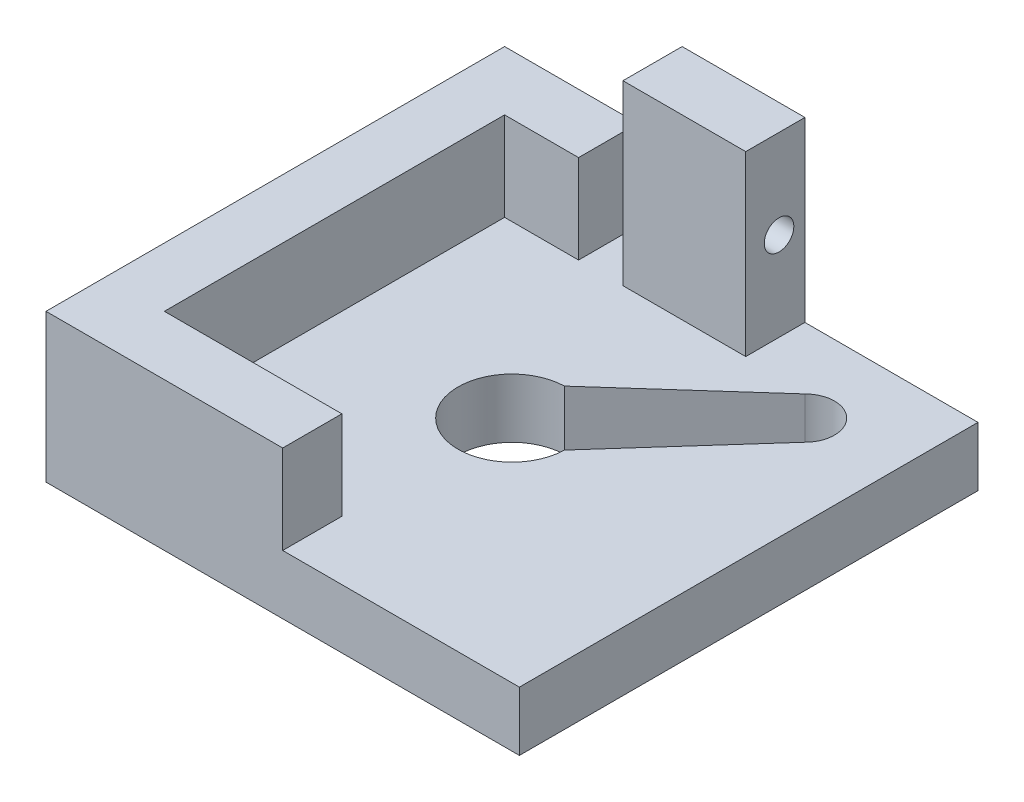
ISO-10303-21;
HEADER;
FILE_DESCRIPTION(('STEP AP214'),'2;1');
FILE_NAME('part.step','',(''),(''),'','','');
FILE_SCHEMA(('AUTOMOTIVE_DESIGN { 1 0 10303 214 1 1 1 1 }'));
ENDSEC;
DATA;
#1=APPLICATION_CONTEXT('core data for automotive mechanical design processes');
#2=APPLICATION_PROTOCOL_DEFINITION('international standard','automotive_design',2000,#1);
#3=PRODUCT_CONTEXT('',#1,'mechanical');
#4=PRODUCT('Part','Part','',(#3));
#5=PRODUCT_RELATED_PRODUCT_CATEGORY('part','',(#4));
#6=PRODUCT_DEFINITION_FORMATION('','',#4);
#7=PRODUCT_DEFINITION_CONTEXT('part definition',#1,'design');
#8=PRODUCT_DEFINITION('design','',#6,#7);
#9=PRODUCT_DEFINITION_SHAPE('','',#8);
#10=(LENGTH_UNIT() NAMED_UNIT(*) SI_UNIT(.MILLI.,.METRE.));
#11=(NAMED_UNIT(*) PLANE_ANGLE_UNIT() SI_UNIT($,.RADIAN.));
#12=(NAMED_UNIT(*) SI_UNIT($,.STERADIAN.) SOLID_ANGLE_UNIT());
#13=UNCERTAINTY_MEASURE_WITH_UNIT(LENGTH_MEASURE(1.E-05),#10,'distance_accuracy_value','');
#14=(GEOMETRIC_REPRESENTATION_CONTEXT(3) GLOBAL_UNCERTAINTY_ASSIGNED_CONTEXT((#13)) GLOBAL_UNIT_ASSIGNED_CONTEXT((#10,
#11,#12)) REPRESENTATION_CONTEXT('',''));
#15=CARTESIAN_POINT('',(0.,0.,0.));
#16=DIRECTION('',(0.,0.,1.));
#17=DIRECTION('',(1.,0.,0.));
#18=AXIS2_PLACEMENT_3D('',#15,#16,#17);
#19=CARTESIAN_POINT('',(0.,4.,0.));
#20=DIRECTION('',(0.,-1.,0.));
#21=DIRECTION('',(0.,0.,-1.));
#22=AXIS2_PLACEMENT_3D('',#19,#20,#21);
#23=PLANE('',#22);
#24=DIRECTION('',(0.,0.,1.));
#25=VECTOR('',#24,1.);
#26=CARTESIAN_POINT('',(-4.,4.,-11.5));
#27=LINE('',#26,#25);
#28=CARTESIAN_POINT('',(-4.,4.,-15.5));
#29=VERTEX_POINT('',#28);
#30=CARTESIAN_POINT('',(-4.,4.,-11.5));
#31=VERTEX_POINT('',#30);
#32=EDGE_CURVE('E199',#29,#31,#27,.T.);
#33=ORIENTED_EDGE('',*,*,#32,.F.);
#34=DIRECTION('',(-1.,0.,0.));
#35=VECTOR('',#34,1.);
#36=CARTESIAN_POINT('',(-16.,4.,-15.5));
#37=LINE('',#36,#35);
#38=CARTESIAN_POINT('',(-7.,4.,-15.5));
#39=VERTEX_POINT('',#38);
#40=EDGE_CURVE('E286',#29,#39,#37,.T.);
#41=ORIENTED_EDGE('',*,*,#40,.T.);
#42=DIRECTION('',(0.,0.,-1.));
#43=VECTOR('',#42,1.);
#44=CARTESIAN_POINT('',(-7.,4.,-15.5));
#45=LINE('',#44,#43);
#46=CARTESIAN_POINT('',(-7.,4.,-11.5));
#47=VERTEX_POINT('',#46);
#48=EDGE_CURVE('E236',#47,#39,#45,.T.);
#49=ORIENTED_EDGE('',*,*,#48,.F.);
#50=DIRECTION('',(1.,0.,0.));
#51=VECTOR('',#50,1.);
#52=CARTESIAN_POINT('',(-7.,4.,-11.5));
#53=LINE('',#52,#51);
#54=CARTESIAN_POINT('',(-12.,4.,-11.5));
#55=VERTEX_POINT('',#54);
#56=EDGE_CURVE('E260',#55,#47,#53,.T.);
#57=ORIENTED_EDGE('',*,*,#56,.F.);
#58=DIRECTION('',(0.,0.,-1.));
#59=VECTOR('',#58,1.);
#60=CARTESIAN_POINT('',(-12.,4.,-11.5));
#61=LINE('',#60,#59);
#62=CARTESIAN_POINT('',(-12.,4.,11.5));
#63=VERTEX_POINT('',#62);
#64=EDGE_CURVE('E257',#63,#55,#61,.T.);
#65=ORIENTED_EDGE('',*,*,#64,.F.);
#66=DIRECTION('',(-1.,0.,0.));
#67=VECTOR('',#66,1.);
#68=CARTESIAN_POINT('',(-12.,4.,11.5));
#69=LINE('',#68,#67);
#70=CARTESIAN_POINT('',(0.,4.,11.5));
#71=VERTEX_POINT('',#70);
#72=EDGE_CURVE('E254',#71,#63,#69,.T.);
#73=ORIENTED_EDGE('',*,*,#72,.F.);
#74=DIRECTION('',(0.,0.,-1.));
#75=VECTOR('',#74,1.);
#76=CARTESIAN_POINT('',(0.,4.,15.5));
#77=LINE('',#76,#75);
#78=CARTESIAN_POINT('',(0.,4.,15.5));
#79=VERTEX_POINT('',#78);
#80=EDGE_CURVE('E231',#79,#71,#77,.T.);
#81=ORIENTED_EDGE('',*,*,#80,.F.);
#82=DIRECTION('',(1.,0.,0.));
#83=VECTOR('',#82,1.);
#84=CARTESIAN_POINT('',(-16.,4.,15.5));
#85=LINE('',#84,#83);
#86=CARTESIAN_POINT('',(16.,4.,15.5));
#87=VERTEX_POINT('',#86);
#88=EDGE_CURVE('E290',#79,#87,#85,.T.);
#89=ORIENTED_EDGE('',*,*,#88,.T.);
#90=DIRECTION('',(0.,0.,-1.));
#91=VECTOR('',#90,1.);
#92=CARTESIAN_POINT('',(16.,4.,15.5));
#93=LINE('',#92,#91);
#94=CARTESIAN_POINT('',(16.,4.,-15.5));
#95=VERTEX_POINT('',#94);
#96=EDGE_CURVE('E283',#87,#95,#93,.T.);
#97=ORIENTED_EDGE('',*,*,#96,.T.);
#98=CARTESIAN_POINT('',(4.3,4.,-15.5));
#99=VERTEX_POINT('',#98);
#100=EDGE_CURVE('E288',#95,#99,#37,.T.);
#101=ORIENTED_EDGE('',*,*,#100,.T.);
#102=DIRECTION('',(0.,0.,-1.));
#103=VECTOR('',#102,1.);
#104=CARTESIAN_POINT('',(4.3,4.,-11.5));
#105=LINE('',#104,#103);
#106=CARTESIAN_POINT('',(4.3,4.,-11.5));
#107=VERTEX_POINT('',#106);
#108=EDGE_CURVE('E206',#107,#99,#105,.T.);
#109=ORIENTED_EDGE('',*,*,#108,.F.);
#110=DIRECTION('',(1.,0.,0.));
#111=VECTOR('',#110,1.);
#112=CARTESIAN_POINT('',(-4.,4.,-11.5));
#113=LINE('',#112,#111);
#114=EDGE_CURVE('E215',#31,#107,#113,.T.);
#115=ORIENTED_EDGE('',*,*,#114,.F.);
#116=EDGE_LOOP('',(#33,#41,#49,#57,#65,#73,#81,#89,#97,#101,#109,#115));
#117=FACE_BOUND('',#116,.T.);
#118=CARTESIAN_POINT('',(9.89949493661086,4.,-9.89949493661249));
#119=DIRECTION('',(0.,1.,0.));
#120=DIRECTION('',(0.,0.,1.));
#121=AXIS2_PLACEMENT_3D('',#118,#119,#120);
#122=CIRCLE('',#121,1.99999999999998);
#123=CARTESIAN_POINT('',(8.48528137423761,4.,-11.3137084989855));
#124=VERTEX_POINT('',#123);
#125=CARTESIAN_POINT('',(11.3137084989841,4.,-8.48528137423954));
#126=VERTEX_POINT('',#125);
#127=EDGE_CURVE('E50',#124,#126,#122,.F.);
#128=ORIENTED_EDGE('',*,*,#127,.T.);
#129=DIRECTION('',(0.66604026201839,0.,-0.745915792412571));
#130=VECTOR('',#129,1.);
#131=CARTESIAN_POINT('',(2.07926623693707,4.,1.85661041546842));
#132=LINE('',#131,#130);
#133=CARTESIAN_POINT('',(3.64865690507424,4.,0.0990090352141621));
#134=VERTEX_POINT('',#133);
#135=EDGE_CURVE('E177',#134,#126,#132,.T.);
#136=ORIENTED_EDGE('',*,*,#135,.F.);
#137=CARTESIAN_POINT('',(0.,4.,0.));
#138=DIRECTION('',(0.,1.,0.));
#139=DIRECTION('',(0.,0.,1.));
#140=AXIS2_PLACEMENT_3D('',#137,#138,#139);
#141=CIRCLE('',#140,3.65);
#142=CARTESIAN_POINT('',(-0.0990090352147705,4.,-3.64865690507423));
#143=VERTEX_POINT('',#142);
#144=EDGE_CURVE('E180',#143,#134,#141,.T.);
#145=ORIENTED_EDGE('',*,*,#144,.F.);
#146=DIRECTION('',(0.74591579241246,0.,-0.666040262018514));
#147=VECTOR('',#146,1.);
#148=CARTESIAN_POINT('',(-1.85661041546877,4.,-2.07926623693677));
#149=LINE('',#148,#147);
#150=EDGE_CURVE('E186',#143,#124,#149,.T.);
#151=ORIENTED_EDGE('',*,*,#150,.T.);
#152=EDGE_LOOP('',(#128,#136,#145,#151));
#153=FACE_BOUND('',#152,.T.);
#154=ADVANCED_FACE('F35',(#117,#153),#23,.F.);
#155=CARTESIAN_POINT('',(0.,0.,0.));
#156=DIRECTION('',(0.,-1.,0.));
#157=DIRECTION('',(0.,0.,-1.));
#158=AXIS2_PLACEMENT_3D('',#155,#156,#157);
#159=PLANE('',#158);
#160=DIRECTION('',(0.,0.,-1.));
#161=VECTOR('',#160,1.);
#162=CARTESIAN_POINT('',(16.,0.,15.5));
#163=LINE('',#162,#161);
#164=CARTESIAN_POINT('',(16.,0.,15.5));
#165=VERTEX_POINT('',#164);
#166=CARTESIAN_POINT('',(16.,0.,-15.5));
#167=VERTEX_POINT('',#166);
#168=EDGE_CURVE('E282',#165,#167,#163,.T.);
#169=ORIENTED_EDGE('',*,*,#168,.F.);
#170=DIRECTION('',(1.,0.,0.));
#171=VECTOR('',#170,1.);
#172=CARTESIAN_POINT('',(-16.,0.,15.5));
#173=LINE('',#172,#171);
#174=CARTESIAN_POINT('',(-16.,0.,15.5));
#175=VERTEX_POINT('',#174);
#176=EDGE_CURVE('E287',#175,#165,#173,.T.);
#177=ORIENTED_EDGE('',*,*,#176,.F.);
#178=DIRECTION('',(0.,0.,1.));
#179=VECTOR('',#178,1.);
#180=CARTESIAN_POINT('',(-16.,0.,15.5));
#181=LINE('',#180,#179);
#182=CARTESIAN_POINT('',(-16.,0.,-15.5));
#183=VERTEX_POINT('',#182);
#184=EDGE_CURVE('E297',#183,#175,#181,.T.);
#185=ORIENTED_EDGE('',*,*,#184,.F.);
#186=DIRECTION('',(-1.,0.,0.));
#187=VECTOR('',#186,1.);
#188=CARTESIAN_POINT('',(-16.,0.,-15.5));
#189=LINE('',#188,#187);
#190=EDGE_CURVE('E295',#167,#183,#189,.T.);
#191=ORIENTED_EDGE('',*,*,#190,.F.);
#192=EDGE_LOOP('',(#169,#177,#185,#191));
#193=FACE_BOUND('',#192,.T.);
#194=DIRECTION('',(0.66604026201839,0.,-0.745915792412571));
#195=VECTOR('',#194,1.);
#196=CARTESIAN_POINT('',(2.07926623693707,0.,1.85661041546842));
#197=LINE('',#196,#195);
#198=CARTESIAN_POINT('',(3.64865690507424,0.,0.0990090352141621));
#199=VERTEX_POINT('',#198);
#200=CARTESIAN_POINT('',(11.3137084989841,0.,-8.48528137423954));
#201=VERTEX_POINT('',#200);
#202=EDGE_CURVE('E172',#199,#201,#197,.T.);
#203=ORIENTED_EDGE('',*,*,#202,.T.);
#204=CARTESIAN_POINT('',(9.89949493661086,0.,-9.89949493661249));
#205=DIRECTION('',(0.,1.,0.));
#206=DIRECTION('',(0.,0.,1.));
#207=AXIS2_PLACEMENT_3D('',#204,#205,#206);
#208=CIRCLE('',#207,1.99999999999998);
#209=CARTESIAN_POINT('',(8.48528137423761,0.,-11.3137084989855));
#210=VERTEX_POINT('',#209);
#211=EDGE_CURVE('E168',#210,#201,#208,.F.);
#212=ORIENTED_EDGE('',*,*,#211,.F.);
#213=DIRECTION('',(0.74591579241246,0.,-0.666040262018514));
#214=VECTOR('',#213,1.);
#215=CARTESIAN_POINT('',(-1.85661041546877,0.,-2.07926623693677));
#216=LINE('',#215,#214);
#217=CARTESIAN_POINT('',(-0.0990090352147707,0.,-3.64865690507423));
#218=VERTEX_POINT('',#217);
#219=EDGE_CURVE('E160',#218,#210,#216,.T.);
#220=ORIENTED_EDGE('',*,*,#219,.F.);
#221=CARTESIAN_POINT('',(0.,0.,0.));
#222=DIRECTION('',(0.,1.,0.));
#223=DIRECTION('',(0.,0.,1.));
#224=AXIS2_PLACEMENT_3D('',#221,#222,#223);
#225=CIRCLE('',#224,3.65);
#226=EDGE_CURVE('E58',#218,#199,#225,.T.);
#227=ORIENTED_EDGE('',*,*,#226,.T.);
#228=EDGE_LOOP('',(#203,#212,#220,#227));
#229=FACE_BOUND('',#228,.T.);
#230=ADVANCED_FACE('F175',(#193,#229),#159,.T.);
#231=CARTESIAN_POINT('',(16.,4.,15.5));
#232=DIRECTION('',(-1.,0.,0.));
#233=DIRECTION('',(0.,0.,1.));
#234=AXIS2_PLACEMENT_3D('',#231,#232,#233);
#235=PLANE('',#234);
#236=ORIENTED_EDGE('',*,*,#168,.T.);
#237=DIRECTION('',(0.,-1.,0.));
#238=VECTOR('',#237,1.);
#239=CARTESIAN_POINT('',(16.,4.,-15.5));
#240=LINE('',#239,#238);
#241=EDGE_CURVE('E11',#95,#167,#240,.T.);
#242=ORIENTED_EDGE('',*,*,#241,.F.);
#243=ORIENTED_EDGE('',*,*,#96,.F.);
#244=DIRECTION('',(0.,-1.,0.));
#245=VECTOR('',#244,1.);
#246=CARTESIAN_POINT('',(16.,4.,15.5));
#247=LINE('',#246,#245);
#248=EDGE_CURVE('E292',#87,#165,#247,.T.);
#249=ORIENTED_EDGE('',*,*,#248,.T.);
#250=EDGE_LOOP('',(#236,#242,#243,#249));
#251=FACE_BOUND('',#250,.T.);
#252=ADVANCED_FACE('F37',(#251),#235,.F.);
#253=CARTESIAN_POINT('',(-16.,4.,-15.5));
#254=DIRECTION('',(0.,0.,1.));
#255=DIRECTION('',(1.,0.,0.));
#256=AXIS2_PLACEMENT_3D('',#253,#254,#255);
#257=PLANE('',#256);
#258=ORIENTED_EDGE('',*,*,#190,.T.);
#259=DIRECTION('',(0.,-1.,0.));
#260=VECTOR('',#259,1.);
#261=CARTESIAN_POINT('',(-16.,4.,-15.5));
#262=LINE('',#261,#260);
#263=CARTESIAN_POINT('',(-16.,10.,-15.5));
#264=VERTEX_POINT('',#263);
#265=EDGE_CURVE('E43',#264,#183,#262,.T.);
#266=ORIENTED_EDGE('',*,*,#265,.F.);
#267=DIRECTION('',(-1.,0.,0.));
#268=VECTOR('',#267,1.);
#269=CARTESIAN_POINT('',(-16.,10.,-15.5));
#270=LINE('',#269,#268);
#271=CARTESIAN_POINT('',(-7.,10.,-15.5));
#272=VERTEX_POINT('',#271);
#273=EDGE_CURVE('E232',#272,#264,#270,.T.);
#274=ORIENTED_EDGE('',*,*,#273,.F.);
#275=DIRECTION('',(0.,-1.,0.));
#276=VECTOR('',#275,1.);
#277=CARTESIAN_POINT('',(-7.,10.,-15.5));
#278=LINE('',#277,#276);
#279=EDGE_CURVE('E251',#272,#39,#278,.T.);
#280=ORIENTED_EDGE('',*,*,#279,.T.);
#281=ORIENTED_EDGE('',*,*,#40,.F.);
#282=DIRECTION('',(0.,-1.,0.));
#283=VECTOR('',#282,1.);
#284=CARTESIAN_POINT('',(-4.,16.,-15.5));
#285=LINE('',#284,#283);
#286=CARTESIAN_POINT('',(-4.,16.,-15.5));
#287=VERTEX_POINT('',#286);
#288=EDGE_CURVE('E212',#287,#29,#285,.T.);
#289=ORIENTED_EDGE('',*,*,#288,.F.);
#290=DIRECTION('',(-1.,0.,0.));
#291=VECTOR('',#290,1.);
#292=CARTESIAN_POINT('',(-4.,16.,-15.5));
#293=LINE('',#292,#291);
#294=CARTESIAN_POINT('',(4.3,16.,-15.5));
#295=VERTEX_POINT('',#294);
#296=EDGE_CURVE('E210',#295,#287,#293,.T.);
#297=ORIENTED_EDGE('',*,*,#296,.F.);
#298=DIRECTION('',(0.,-1.,0.));
#299=VECTOR('',#298,1.);
#300=CARTESIAN_POINT('',(4.3,16.,-15.5));
#301=LINE('',#300,#299);
#302=EDGE_CURVE('E222',#295,#99,#301,.T.);
#303=ORIENTED_EDGE('',*,*,#302,.T.);
#304=ORIENTED_EDGE('',*,*,#100,.F.);
#305=ORIENTED_EDGE('',*,*,#241,.T.);
#306=EDGE_LOOP('',(#258,#266,#274,#280,#281,#289,#297,#303,#304,#305));
#307=FACE_BOUND('',#306,.T.);
#308=ADVANCED_FACE('F336',(#307),#257,.F.);
#309=CARTESIAN_POINT('',(-16.,4.,15.5));
#310=DIRECTION('',(1.,0.,0.));
#311=DIRECTION('',(0.,0.,-1.));
#312=AXIS2_PLACEMENT_3D('',#309,#310,#311);
#313=PLANE('',#312);
#314=ORIENTED_EDGE('',*,*,#184,.T.);
#315=DIRECTION('',(0.,-1.,0.));
#316=VECTOR('',#315,1.);
#317=CARTESIAN_POINT('',(-16.,4.,15.5));
#318=LINE('',#317,#316);
#319=CARTESIAN_POINT('',(-16.,10.,15.5));
#320=VERTEX_POINT('',#319);
#321=EDGE_CURVE('E302',#320,#175,#318,.T.);
#322=ORIENTED_EDGE('',*,*,#321,.F.);
#323=DIRECTION('',(0.,0.,1.));
#324=VECTOR('',#323,1.);
#325=CARTESIAN_POINT('',(-16.,10.,-15.5));
#326=LINE('',#325,#324);
#327=EDGE_CURVE('E235',#264,#320,#326,.T.);
#328=ORIENTED_EDGE('',*,*,#327,.F.);
#329=ORIENTED_EDGE('',*,*,#265,.T.);
#330=EDGE_LOOP('',(#314,#322,#328,#329));
#331=FACE_BOUND('',#330,.T.);
#332=ADVANCED_FACE('F308',(#331),#313,.F.);
#333=CARTESIAN_POINT('',(-16.,4.,15.5));
#334=DIRECTION('',(0.,0.,-1.));
#335=DIRECTION('',(-1.,0.,0.));
#336=AXIS2_PLACEMENT_3D('',#333,#334,#335);
#337=PLANE('',#336);
#338=ORIENTED_EDGE('',*,*,#176,.T.);
#339=ORIENTED_EDGE('',*,*,#248,.F.);
#340=ORIENTED_EDGE('',*,*,#88,.F.);
#341=DIRECTION('',(0.,-1.,0.));
#342=VECTOR('',#341,1.);
#343=CARTESIAN_POINT('',(0.,10.,15.5));
#344=LINE('',#343,#342);
#345=CARTESIAN_POINT('',(0.,10.,15.5));
#346=VERTEX_POINT('',#345);
#347=EDGE_CURVE('E279',#346,#79,#344,.T.);
#348=ORIENTED_EDGE('',*,*,#347,.F.);
#349=DIRECTION('',(1.,0.,0.));
#350=VECTOR('',#349,1.);
#351=CARTESIAN_POINT('',(-16.,10.,15.5));
#352=LINE('',#351,#350);
#353=EDGE_CURVE('E239',#320,#346,#352,.T.);
#354=ORIENTED_EDGE('',*,*,#353,.F.);
#355=ORIENTED_EDGE('',*,*,#321,.T.);
#356=EDGE_LOOP('',(#338,#339,#340,#348,#354,#355));
#357=FACE_BOUND('',#356,.T.);
#358=ADVANCED_FACE('F316',(#357),#337,.F.);
#359=CARTESIAN_POINT('',(0.,10.,15.5));
#360=DIRECTION('',(-1.,0.,0.));
#361=DIRECTION('',(0.,0.,1.));
#362=AXIS2_PLACEMENT_3D('',#359,#360,#361);
#363=PLANE('',#362);
#364=ORIENTED_EDGE('',*,*,#80,.T.);
#365=DIRECTION('',(0.,-1.,0.));
#366=VECTOR('',#365,1.);
#367=CARTESIAN_POINT('',(0.,10.,11.5));
#368=LINE('',#367,#366);
#369=CARTESIAN_POINT('',(0.,10.,11.5));
#370=VERTEX_POINT('',#369);
#371=EDGE_CURVE('E276',#370,#71,#368,.T.);
#372=ORIENTED_EDGE('',*,*,#371,.F.);
#373=DIRECTION('',(0.,0.,-1.));
#374=VECTOR('',#373,1.);
#375=CARTESIAN_POINT('',(0.,10.,15.5));
#376=LINE('',#375,#374);
#377=EDGE_CURVE('E241',#346,#370,#376,.T.);
#378=ORIENTED_EDGE('',*,*,#377,.F.);
#379=ORIENTED_EDGE('',*,*,#347,.T.);
#380=EDGE_LOOP('',(#364,#372,#378,#379));
#381=FACE_BOUND('',#380,.T.);
#382=ADVANCED_FACE('F328',(#381),#363,.F.);
#383=CARTESIAN_POINT('',(-12.,10.,11.5));
#384=DIRECTION('',(0.,0.,1.));
#385=DIRECTION('',(1.,0.,0.));
#386=AXIS2_PLACEMENT_3D('',#383,#384,#385);
#387=PLANE('',#386);
#388=ORIENTED_EDGE('',*,*,#72,.T.);
#389=DIRECTION('',(0.,-1.,0.));
#390=VECTOR('',#389,1.);
#391=CARTESIAN_POINT('',(-12.,10.,11.5));
#392=LINE('',#391,#390);
#393=CARTESIAN_POINT('',(-12.,10.,11.5));
#394=VERTEX_POINT('',#393);
#395=EDGE_CURVE('E273',#394,#63,#392,.T.);
#396=ORIENTED_EDGE('',*,*,#395,.F.);
#397=DIRECTION('',(-1.,0.,0.));
#398=VECTOR('',#397,1.);
#399=CARTESIAN_POINT('',(-12.,10.,11.5));
#400=LINE('',#399,#398);
#401=EDGE_CURVE('E243',#370,#394,#400,.T.);
#402=ORIENTED_EDGE('',*,*,#401,.F.);
#403=ORIENTED_EDGE('',*,*,#371,.T.);
#404=EDGE_LOOP('',(#388,#396,#402,#403));
#405=FACE_BOUND('',#404,.T.);
#406=ADVANCED_FACE('F349',(#405),#387,.F.);
#407=CARTESIAN_POINT('',(-12.,10.,-11.5));
#408=DIRECTION('',(-1.,0.,0.));
#409=DIRECTION('',(0.,0.,1.));
#410=AXIS2_PLACEMENT_3D('',#407,#408,#409);
#411=PLANE('',#410);
#412=ORIENTED_EDGE('',*,*,#64,.T.);
#413=DIRECTION('',(0.,-1.,0.));
#414=VECTOR('',#413,1.);
#415=CARTESIAN_POINT('',(-12.,10.,-11.5));
#416=LINE('',#415,#414);
#417=CARTESIAN_POINT('',(-12.,10.,-11.5));
#418=VERTEX_POINT('',#417);
#419=EDGE_CURVE('E270',#418,#55,#416,.T.);
#420=ORIENTED_EDGE('',*,*,#419,.F.);
#421=DIRECTION('',(0.,0.,-1.));
#422=VECTOR('',#421,1.);
#423=CARTESIAN_POINT('',(-12.,10.,-11.5));
#424=LINE('',#423,#422);
#425=EDGE_CURVE('E245',#394,#418,#424,.T.);
#426=ORIENTED_EDGE('',*,*,#425,.F.);
#427=ORIENTED_EDGE('',*,*,#395,.T.);
#428=EDGE_LOOP('',(#412,#420,#426,#427));
#429=FACE_BOUND('',#428,.T.);
#430=ADVANCED_FACE('F347',(#429),#411,.F.);
#431=CARTESIAN_POINT('',(-7.,10.,-11.5));
#432=DIRECTION('',(0.,0.,-1.));
#433=DIRECTION('',(-1.,0.,0.));
#434=AXIS2_PLACEMENT_3D('',#431,#432,#433);
#435=PLANE('',#434);
#436=ORIENTED_EDGE('',*,*,#56,.T.);
#437=DIRECTION('',(0.,-1.,0.));
#438=VECTOR('',#437,1.);
#439=CARTESIAN_POINT('',(-7.,10.,-11.5));
#440=LINE('',#439,#438);
#441=CARTESIAN_POINT('',(-7.,10.,-11.5));
#442=VERTEX_POINT('',#441);
#443=EDGE_CURVE('E267',#442,#47,#440,.T.);
#444=ORIENTED_EDGE('',*,*,#443,.F.);
#445=DIRECTION('',(1.,0.,0.));
#446=VECTOR('',#445,1.);
#447=CARTESIAN_POINT('',(-7.,10.,-11.5));
#448=LINE('',#447,#446);
#449=EDGE_CURVE('E247',#418,#442,#448,.T.);
#450=ORIENTED_EDGE('',*,*,#449,.F.);
#451=ORIENTED_EDGE('',*,*,#419,.T.);
#452=EDGE_LOOP('',(#436,#444,#450,#451));
#453=FACE_BOUND('',#452,.T.);
#454=ADVANCED_FACE('F342',(#453),#435,.F.);
#455=CARTESIAN_POINT('',(-7.,10.,-15.5));
#456=DIRECTION('',(-1.,0.,0.));
#457=DIRECTION('',(0.,0.,1.));
#458=AXIS2_PLACEMENT_3D('',#455,#456,#457);
#459=PLANE('',#458);
#460=ORIENTED_EDGE('',*,*,#48,.T.);
#461=ORIENTED_EDGE('',*,*,#279,.F.);
#462=DIRECTION('',(0.,0.,-1.));
#463=VECTOR('',#462,1.);
#464=CARTESIAN_POINT('',(-7.,10.,-15.5));
#465=LINE('',#464,#463);
#466=EDGE_CURVE('E249',#442,#272,#465,.T.);
#467=ORIENTED_EDGE('',*,*,#466,.F.);
#468=ORIENTED_EDGE('',*,*,#443,.T.);
#469=EDGE_LOOP('',(#460,#461,#467,#468));
#470=FACE_BOUND('',#469,.T.);
#471=ADVANCED_FACE('F339',(#470),#459,.F.);
#472=CARTESIAN_POINT('',(0.,10.,0.));
#473=DIRECTION('',(0.,-1.,0.));
#474=DIRECTION('',(0.,0.,-1.));
#475=AXIS2_PLACEMENT_3D('',#472,#473,#474);
#476=PLANE('',#475);
#477=ORIENTED_EDGE('',*,*,#273,.T.);
#478=ORIENTED_EDGE('',*,*,#327,.T.);
#479=ORIENTED_EDGE('',*,*,#353,.T.);
#480=ORIENTED_EDGE('',*,*,#377,.T.);
#481=ORIENTED_EDGE('',*,*,#401,.T.);
#482=ORIENTED_EDGE('',*,*,#425,.T.);
#483=ORIENTED_EDGE('',*,*,#449,.T.);
#484=ORIENTED_EDGE('',*,*,#466,.T.);
#485=EDGE_LOOP('',(#477,#478,#479,#480,#481,#482,#483,#484));
#486=FACE_BOUND('',#485,.T.);
#487=ADVANCED_FACE('F332',(#486),#476,.F.);
#488=CARTESIAN_POINT('',(-4.,16.,-11.5));
#489=DIRECTION('',(1.,0.,0.));
#490=DIRECTION('',(0.,0.,-1.));
#491=AXIS2_PLACEMENT_3D('',#488,#489,#490);
#492=PLANE('',#491);
#493=ORIENTED_EDGE('',*,*,#32,.T.);
#494=DIRECTION('',(0.,-1.,0.));
#495=VECTOR('',#494,1.);
#496=CARTESIAN_POINT('',(-4.,16.,-11.5));
#497=LINE('',#496,#495);
#498=CARTESIAN_POINT('',(-4.,16.,-11.5));
#499=VERTEX_POINT('',#498);
#500=EDGE_CURVE('E228',#499,#31,#497,.T.);
#501=ORIENTED_EDGE('',*,*,#500,.F.);
#502=DIRECTION('',(0.,0.,1.));
#503=VECTOR('',#502,1.);
#504=CARTESIAN_POINT('',(-4.,16.,-11.5));
#505=LINE('',#504,#503);
#506=EDGE_CURVE('E202',#287,#499,#505,.T.);
#507=ORIENTED_EDGE('',*,*,#506,.F.);
#508=ORIENTED_EDGE('',*,*,#288,.T.);
#509=EDGE_LOOP('',(#493,#501,#507,#508));
#510=FACE_BOUND('',#509,.T.);
#511=ADVANCED_FACE('F444',(#510),#492,.F.);
#512=CARTESIAN_POINT('',(-4.,16.,-11.5));
#513=DIRECTION('',(0.,0.,-1.));
#514=DIRECTION('',(-1.,0.,0.));
#515=AXIS2_PLACEMENT_3D('',#512,#513,#514);
#516=PLANE('',#515);
#517=ORIENTED_EDGE('',*,*,#114,.T.);
#518=DIRECTION('',(0.,-1.,0.));
#519=VECTOR('',#518,1.);
#520=CARTESIAN_POINT('',(4.3,16.,-11.5));
#521=LINE('',#520,#519);
#522=CARTESIAN_POINT('',(4.3,16.,-11.5));
#523=VERTEX_POINT('',#522);
#524=EDGE_CURVE('E225',#523,#107,#521,.T.);
#525=ORIENTED_EDGE('',*,*,#524,.F.);
#526=DIRECTION('',(1.,0.,0.));
#527=VECTOR('',#526,1.);
#528=CARTESIAN_POINT('',(-4.,16.,-11.5));
#529=LINE('',#528,#527);
#530=EDGE_CURVE('E205',#499,#523,#529,.T.);
#531=ORIENTED_EDGE('',*,*,#530,.F.);
#532=ORIENTED_EDGE('',*,*,#500,.T.);
#533=EDGE_LOOP('',(#517,#525,#531,#532));
#534=FACE_BOUND('',#533,.T.);
#535=ADVANCED_FACE('F440',(#534),#516,.F.);
#536=CARTESIAN_POINT('',(4.3,16.,-11.5));
#537=DIRECTION('',(-1.,0.,0.));
#538=DIRECTION('',(0.,0.,1.));
#539=AXIS2_PLACEMENT_3D('',#536,#537,#538);
#540=PLANE('',#539);
#541=CARTESIAN_POINT('',(4.3,10.,-13.75));
#542=DIRECTION('',(1.,0.,0.));
#543=DIRECTION('',(0.,0.,-1.));
#544=AXIS2_PLACEMENT_3D('',#541,#542,#543);
#545=CIRCLE('',#544,1.);
#546=CARTESIAN_POINT('',(4.3,10.,-14.75));
#547=VERTEX_POINT('',#546);
#548=EDGE_CURVE('E192',#547,#547,#545,.T.);
#549=ORIENTED_EDGE('',*,*,#548,.F.);
#550=EDGE_LOOP('',(#549));
#551=FACE_BOUND('',#550,.T.);
#552=ORIENTED_EDGE('',*,*,#108,.T.);
#553=ORIENTED_EDGE('',*,*,#302,.F.);
#554=DIRECTION('',(0.,0.,-1.));
#555=VECTOR('',#554,1.);
#556=CARTESIAN_POINT('',(4.3,16.,-11.5));
#557=LINE('',#556,#555);
#558=EDGE_CURVE('E208',#523,#295,#557,.T.);
#559=ORIENTED_EDGE('',*,*,#558,.F.);
#560=ORIENTED_EDGE('',*,*,#524,.T.);
#561=EDGE_LOOP('',(#552,#553,#559,#560));
#562=FACE_BOUND('',#561,.T.);
#563=ADVANCED_FACE('F436',(#551,#562),#540,.F.);
#564=CARTESIAN_POINT('',(0.,16.,0.));
#565=DIRECTION('',(0.,-1.,0.));
#566=DIRECTION('',(0.,0.,-1.));
#567=AXIS2_PLACEMENT_3D('',#564,#565,#566);
#568=PLANE('',#567);
#569=ORIENTED_EDGE('',*,*,#506,.T.);
#570=ORIENTED_EDGE('',*,*,#530,.T.);
#571=ORIENTED_EDGE('',*,*,#558,.T.);
#572=ORIENTED_EDGE('',*,*,#296,.T.);
#573=EDGE_LOOP('',(#569,#570,#571,#572));
#574=FACE_BOUND('',#573,.T.);
#575=ADVANCED_FACE('F432',(#574),#568,.F.);
#576=CARTESIAN_POINT('',(-0.699999999999999,10.,-13.75));
#577=DIRECTION('',(1.,0.,0.));
#578=DIRECTION('',(0.,0.,-1.));
#579=AXIS2_PLACEMENT_3D('',#576,#577,#578);
#580=CYLINDRICAL_SURFACE('',#579,1.);
#581=CARTESIAN_POINT('',(-0.699999999999999,10.,-13.75));
#582=DIRECTION('',(1.,0.,0.));
#583=DIRECTION('',(0.,0.,-1.));
#584=AXIS2_PLACEMENT_3D('',#581,#582,#583);
#585=CIRCLE('',#584,1.);
#586=CARTESIAN_POINT('',(-0.699999999999999,10.,-14.75));
#587=VERTEX_POINT('',#586);
#588=EDGE_CURVE('E196',#587,#587,#585,.T.);
#589=ORIENTED_EDGE('',*,*,#588,.F.);
#590=EDGE_LOOP('',(#589));
#591=FACE_BOUND('',#590,.T.);
#592=ORIENTED_EDGE('',*,*,#548,.T.);
#593=EDGE_LOOP('',(#592));
#594=FACE_BOUND('',#593,.T.);
#595=ADVANCED_FACE('F428',(#591,#594),#580,.F.);
#596=CARTESIAN_POINT('',(-0.699999999999999,10.,-13.75));
#597=DIRECTION('',(1.,0.,0.));
#598=DIRECTION('',(0.,0.,-1.));
#599=AXIS2_PLACEMENT_3D('',#596,#597,#598);
#600=PLANE('',#599);
#601=ORIENTED_EDGE('',*,*,#588,.T.);
#602=EDGE_LOOP('',(#601));
#603=FACE_BOUND('',#602,.T.);
#604=ADVANCED_FACE('F393',(#603),#600,.T.);
#605=CARTESIAN_POINT('',(9.89949493661086,0.,-9.89949493661249));
#606=DIRECTION('',(0.,1.,0.));
#607=DIRECTION('',(0.,0.,1.));
#608=AXIS2_PLACEMENT_3D('',#605,#606,#607);
#609=CYLINDRICAL_SURFACE('',#608,1.99999999999998);
#610=ORIENTED_EDGE('',*,*,#127,.F.);
#611=DIRECTION('',(0.,1.,0.));
#612=VECTOR('',#611,1.);
#613=CARTESIAN_POINT('',(8.48528137423761,0.,-11.3137084989855));
#614=LINE('',#613,#612);
#615=EDGE_CURVE('E163',#210,#124,#614,.T.);
#616=ORIENTED_EDGE('',*,*,#615,.F.);
#617=ORIENTED_EDGE('',*,*,#211,.T.);
#618=DIRECTION('',(0.,1.,0.));
#619=VECTOR('',#618,1.);
#620=CARTESIAN_POINT('',(11.3137084989841,0.,-8.48528137423954));
#621=LINE('',#620,#619);
#622=EDGE_CURVE('E190',#201,#126,#621,.T.);
#623=ORIENTED_EDGE('',*,*,#622,.T.);
#624=EDGE_LOOP('',(#610,#616,#617,#623));
#625=FACE_BOUND('',#624,.T.);
#626=ADVANCED_FACE('F170',(#625),#609,.F.);
#627=CARTESIAN_POINT('',(2.07926623693707,0.,1.85661041546842));
#628=DIRECTION('',(0.745915792412571,0.,0.66604026201839));
#629=DIRECTION('',(0.66604026201839,0.,-0.745915792412571));
#630=AXIS2_PLACEMENT_3D('',#627,#628,#629);
#631=PLANE('',#630);
#632=ORIENTED_EDGE('',*,*,#135,.T.);
#633=ORIENTED_EDGE('',*,*,#622,.F.);
#634=ORIENTED_EDGE('',*,*,#202,.F.);
#635=DIRECTION('',(0.,1.,0.));
#636=VECTOR('',#635,1.);
#637=CARTESIAN_POINT('',(3.64865690507424,0.,0.0990090352141621));
#638=LINE('',#637,#636);
#639=EDGE_CURVE('E193',#199,#134,#638,.T.);
#640=ORIENTED_EDGE('',*,*,#639,.T.);
#641=EDGE_LOOP('',(#632,#633,#634,#640));
#642=FACE_BOUND('',#641,.T.);
#643=ADVANCED_FACE('F392',(#642),#631,.F.);
#644=CARTESIAN_POINT('',(0.,0.,0.));
#645=DIRECTION('',(0.,1.,0.));
#646=DIRECTION('',(0.,0.,1.));
#647=AXIS2_PLACEMENT_3D('',#644,#645,#646);
#648=CYLINDRICAL_SURFACE('',#647,3.65);
#649=ORIENTED_EDGE('',*,*,#144,.T.);
#650=ORIENTED_EDGE('',*,*,#639,.F.);
#651=ORIENTED_EDGE('',*,*,#226,.F.);
#652=DIRECTION('',(0.,1.,0.));
#653=VECTOR('',#652,1.);
#654=CARTESIAN_POINT('',(-0.0990090352147705,0.,-3.64865690507423));
#655=LINE('',#654,#653);
#656=EDGE_CURVE('E165',#218,#143,#655,.T.);
#657=ORIENTED_EDGE('',*,*,#656,.T.);
#658=EDGE_LOOP('',(#649,#650,#651,#657));
#659=FACE_BOUND('',#658,.T.);
#660=ADVANCED_FACE('F404',(#659),#648,.F.);
#661=CARTESIAN_POINT('',(-1.85661041546877,0.,-2.07926623693677));
#662=DIRECTION('',(0.666040262018514,0.,0.74591579241246));
#663=DIRECTION('',(0.74591579241246,0.,-0.666040262018514));
#664=AXIS2_PLACEMENT_3D('',#661,#662,#663);
#665=PLANE('',#664);
#666=ORIENTED_EDGE('',*,*,#150,.F.);
#667=ORIENTED_EDGE('',*,*,#656,.F.);
#668=ORIENTED_EDGE('',*,*,#219,.T.);
#669=ORIENTED_EDGE('',*,*,#615,.T.);
#670=EDGE_LOOP('',(#666,#667,#668,#669));
#671=FACE_BOUND('',#670,.T.);
#672=ADVANCED_FACE('F162',(#671),#665,.T.);
#673=CLOSED_SHELL('',(#154,#230,#252,#308,#332,#358,#382,#406,#430,#454,#471,#487,#511,#535,
#563,#575,#595,#604,#626,#643,#660,#672));
#674=MANIFOLD_SOLID_BREP('B2',#673);
#675=ADVANCED_BREP_SHAPE_REPRESENTATION('',(#18,#674),#14);
#676=SHAPE_DEFINITION_REPRESENTATION(#9,#675);
ENDSEC;
END-ISO-10303-21;
